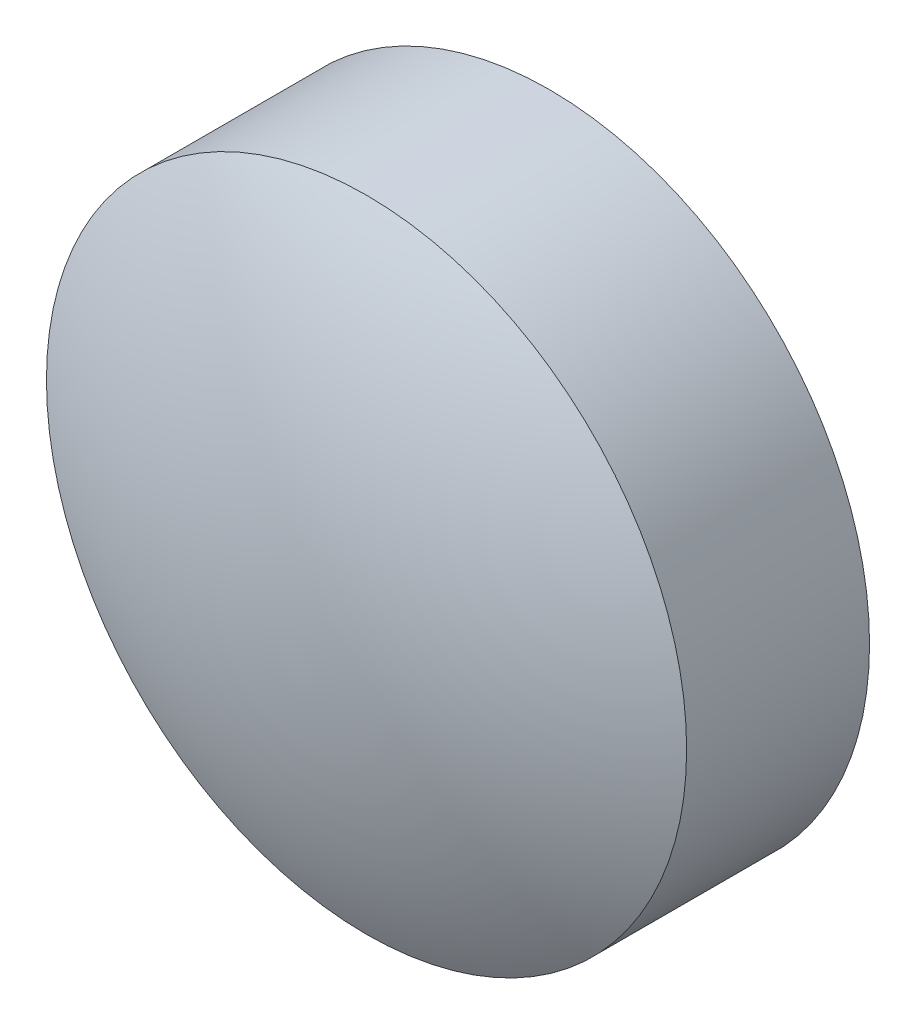
ISO-10303-21;
HEADER;
FILE_DESCRIPTION(('STEP AP214'),'2;1');
FILE_NAME('part.step','',(''),(''),'','','');
FILE_SCHEMA(('AUTOMOTIVE_DESIGN { 1 0 10303 214 1 1 1 1 }'));
ENDSEC;
DATA;
#1=APPLICATION_CONTEXT('core data for automotive mechanical design processes');
#2=APPLICATION_PROTOCOL_DEFINITION('international standard','automotive_design',2000,#1);
#3=PRODUCT_CONTEXT('',#1,'mechanical');
#4=PRODUCT('Part','Part','',(#3));
#5=PRODUCT_RELATED_PRODUCT_CATEGORY('part','',(#4));
#6=PRODUCT_DEFINITION_FORMATION('','',#4);
#7=PRODUCT_DEFINITION_CONTEXT('part definition',#1,'design');
#8=PRODUCT_DEFINITION('design','',#6,#7);
#9=PRODUCT_DEFINITION_SHAPE('','',#8);
#10=(LENGTH_UNIT() NAMED_UNIT(*) SI_UNIT(.MILLI.,.METRE.));
#11=(NAMED_UNIT(*) PLANE_ANGLE_UNIT() SI_UNIT($,.RADIAN.));
#12=(NAMED_UNIT(*) SI_UNIT($,.STERADIAN.) SOLID_ANGLE_UNIT());
#13=UNCERTAINTY_MEASURE_WITH_UNIT(LENGTH_MEASURE(1.E-05),#10,'distance_accuracy_value','');
#14=(GEOMETRIC_REPRESENTATION_CONTEXT(3) GLOBAL_UNCERTAINTY_ASSIGNED_CONTEXT((#13)) GLOBAL_UNIT_ASSIGNED_CONTEXT((#10,
#11,#12)) REPRESENTATION_CONTEXT('',''));
#15=CARTESIAN_POINT('',(0.,0.,0.));
#16=DIRECTION('',(0.,0.,1.));
#17=DIRECTION('',(1.,0.,0.));
#18=AXIS2_PLACEMENT_3D('',#15,#16,#17);
#19=CARTESIAN_POINT('',(0.,0.,8.));
#20=DIRECTION('',(0.,0.,-1.));
#21=DIRECTION('',(-1.,0.,0.));
#22=AXIS2_PLACEMENT_3D('',#19,#20,#21);
#23=CYLINDRICAL_SURFACE('',#22,14.);
#24=CARTESIAN_POINT('',(0.,0.,8.));
#25=DIRECTION('',(0.,0.,1.));
#26=DIRECTION('',(1.,0.,0.));
#27=AXIS2_PLACEMENT_3D('',#24,#25,#26);
#28=CIRCLE('',#27,14.);
#29=CARTESIAN_POINT('',(14.,0.,8.));
#30=VERTEX_POINT('',#29);
#31=EDGE_CURVE('E10',#30,#30,#28,.T.);
#32=ORIENTED_EDGE('',*,*,#31,.F.);
#33=EDGE_LOOP('',(#32));
#34=FACE_BOUND('',#33,.T.);
#35=CARTESIAN_POINT('',(0.,0.,0.));
#36=DIRECTION('',(0.,0.,1.));
#37=DIRECTION('',(1.,0.,0.));
#38=AXIS2_PLACEMENT_3D('',#35,#36,#37);
#39=CIRCLE('',#38,14.);
#40=CARTESIAN_POINT('',(14.,0.,0.));
#41=VERTEX_POINT('',#40);
#42=EDGE_CURVE('E38',#41,#41,#39,.T.);
#43=ORIENTED_EDGE('',*,*,#42,.T.);
#44=EDGE_LOOP('',(#43));
#45=FACE_BOUND('',#44,.T.);
#46=ADVANCED_FACE('F31',(#34,#45),#23,.T.);
#47=CARTESIAN_POINT('',(0.,0.,-18.25));
#48=DIRECTION('',(0.,0.,1.));
#49=DIRECTION('',(1.,0.,0.));
#50=AXIS2_PLACEMENT_3D('',#47,#48,#49);
#51=SPHERICAL_SURFACE('',#50,29.75);
#52=ORIENTED_EDGE('',*,*,#31,.T.);
#53=EDGE_LOOP('',(#52));
#54=FACE_BOUND('',#53,.T.);
#55=ADVANCED_FACE('F33',(#54),#51,.T.);
#56=CARTESIAN_POINT('',(0.,0.,0.));
#57=DIRECTION('',(0.,0.,1.));
#58=DIRECTION('',(1.,0.,0.));
#59=AXIS2_PLACEMENT_3D('',#56,#57,#58);
#60=PLANE('',#59);
#61=ORIENTED_EDGE('',*,*,#42,.F.);
#62=EDGE_LOOP('',(#61));
#63=FACE_BOUND('',#62,.T.);
#64=ADVANCED_FACE('F45',(#63),#60,.F.);
#65=CLOSED_SHELL('',(#46,#55,#64));
#66=MANIFOLD_SOLID_BREP('B2',#65);
#67=ADVANCED_BREP_SHAPE_REPRESENTATION('',(#18,#66),#14);
#68=SHAPE_DEFINITION_REPRESENTATION(#9,#67);
ENDSEC;
END-ISO-10303-21;
